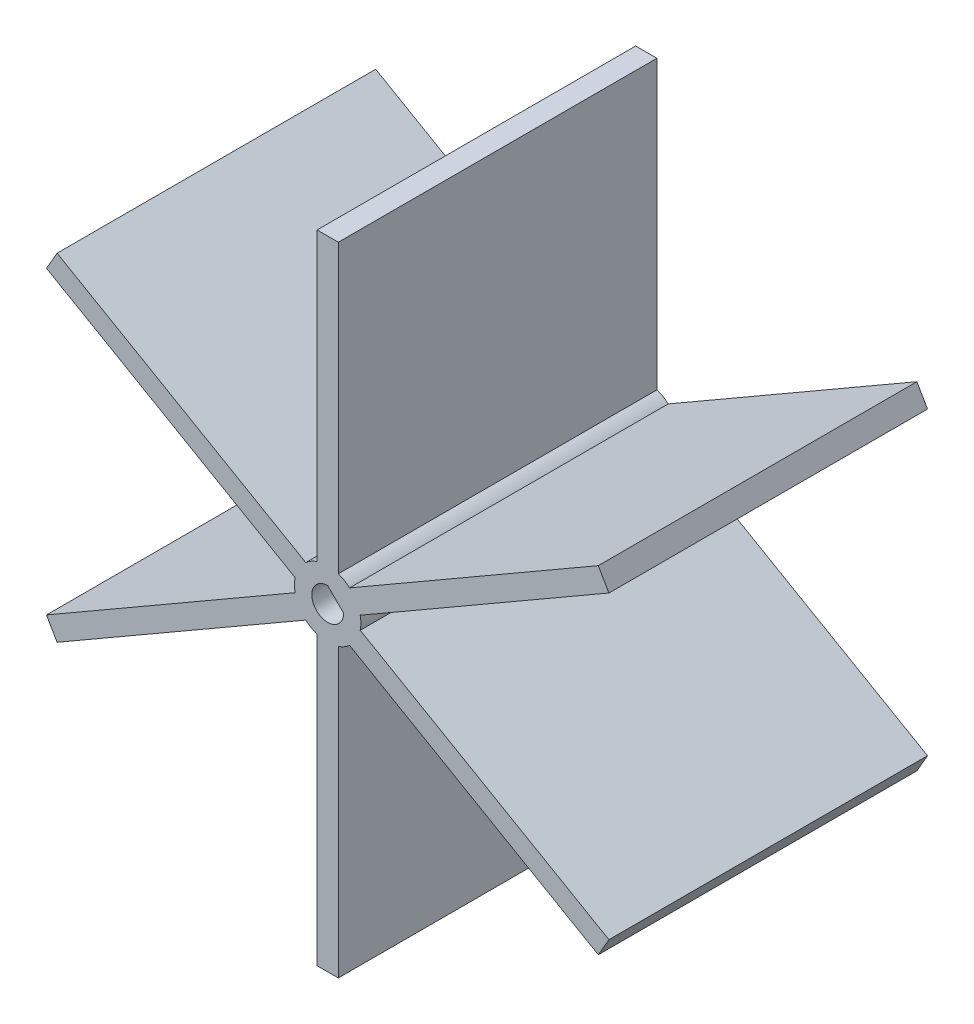
ISO-10303-21;
HEADER;
FILE_DESCRIPTION(('STEP AP214'),'2;1');
FILE_NAME('part.step','',(''),(''),'','','');
FILE_SCHEMA(('AUTOMOTIVE_DESIGN { 1 0 10303 214 1 1 1 1 }'));
ENDSEC;
DATA;
#1=APPLICATION_CONTEXT('core data for automotive mechanical design processes');
#2=APPLICATION_PROTOCOL_DEFINITION('international standard','automotive_design',2000,#1);
#3=PRODUCT_CONTEXT('',#1,'mechanical');
#4=PRODUCT('Part','Part','',(#3));
#5=PRODUCT_RELATED_PRODUCT_CATEGORY('part','',(#4));
#6=PRODUCT_DEFINITION_FORMATION('','',#4);
#7=PRODUCT_DEFINITION_CONTEXT('part definition',#1,'design');
#8=PRODUCT_DEFINITION('design','',#6,#7);
#9=PRODUCT_DEFINITION_SHAPE('','',#8);
#10=(LENGTH_UNIT() NAMED_UNIT(*) SI_UNIT(.MILLI.,.METRE.));
#11=(NAMED_UNIT(*) PLANE_ANGLE_UNIT() SI_UNIT($,.RADIAN.));
#12=(NAMED_UNIT(*) SI_UNIT($,.STERADIAN.) SOLID_ANGLE_UNIT());
#13=UNCERTAINTY_MEASURE_WITH_UNIT(LENGTH_MEASURE(1.E-05),#10,'distance_accuracy_value','');
#14=(GEOMETRIC_REPRESENTATION_CONTEXT(3) GLOBAL_UNCERTAINTY_ASSIGNED_CONTEXT((#13)) GLOBAL_UNIT_ASSIGNED_CONTEXT((#10,
#11,#12)) REPRESENTATION_CONTEXT('',''));
#15=CARTESIAN_POINT('',(0.,0.,0.));
#16=DIRECTION('',(0.,0.,1.));
#17=DIRECTION('',(1.,0.,0.));
#18=AXIS2_PLACEMENT_3D('',#15,#16,#17);
#19=CARTESIAN_POINT('',(0.,0.,0.));
#20=DIRECTION('',(0.,0.,1.));
#21=DIRECTION('',(1.,0.,0.));
#22=AXIS2_PLACEMENT_3D('',#19,#20,#21);
#23=PLANE('',#22);
#24=DIRECTION('',(-0.866025403784439,0.5,0.));
#25=VECTOR('',#24,1.);
#26=CARTESIAN_POINT('',(1.27,2.19970452561247,0.));
#27=LINE('',#26,#25);
#28=CARTESIAN_POINT('',(-5.24262080022321,5.9597678977513,0.));
#29=VERTEX_POINT('',#28);
#30=CARTESIAN_POINT('',(-64.7211357683742,40.2997045256125,0.));
#31=VERTEX_POINT('',#30);
#32=EDGE_CURVE('E607',#29,#31,#27,.T.);
#33=ORIENTED_EDGE('',*,*,#32,.F.);
#34=CARTESIAN_POINT('',(0.,0.,0.));
#35=DIRECTION('',(0.,0.,1.));
#36=DIRECTION('',(1.,0.,0.));
#37=AXIS2_PLACEMENT_3D('',#34,#35,#36);
#38=CIRCLE('',#37,7.9375);
#39=CARTESIAN_POINT('',(-2.54,7.52012674427765,0.));
#40=VERTEX_POINT('',#39);
#41=EDGE_CURVE('E446',#40,#29,#38,.T.);
#42=ORIENTED_EDGE('',*,*,#41,.F.);
#43=DIRECTION('',(0.,1.,0.));
#44=VECTOR('',#43,1.);
#45=CARTESIAN_POINT('',(-2.54,0.,0.));
#46=LINE('',#45,#44);
#47=CARTESIAN_POINT('',(-2.54,76.2,0.));
#48=VERTEX_POINT('',#47);
#49=EDGE_CURVE('E620',#40,#48,#46,.T.);
#50=ORIENTED_EDGE('',*,*,#49,.T.);
#51=DIRECTION('',(1.,0.,0.));
#52=VECTOR('',#51,1.);
#53=CARTESIAN_POINT('',(0.,76.2,0.));
#54=LINE('',#53,#52);
#55=CARTESIAN_POINT('',(2.54,76.2,0.));
#56=VERTEX_POINT('',#55);
#57=EDGE_CURVE('E627',#48,#56,#54,.T.);
#58=ORIENTED_EDGE('',*,*,#57,.T.);
#59=DIRECTION('',(0.,1.,0.));
#60=VECTOR('',#59,1.);
#61=CARTESIAN_POINT('',(2.54,0.,0.));
#62=LINE('',#61,#60);
#63=CARTESIAN_POINT('',(2.54,7.52012674427765,0.));
#64=VERTEX_POINT('',#63);
#65=EDGE_CURVE('E492',#64,#56,#62,.T.);
#66=ORIENTED_EDGE('',*,*,#65,.F.);
#67=CARTESIAN_POINT('',(5.24262080022321,5.9597678977513,0.));
#68=VERTEX_POINT('',#67);
#69=EDGE_CURVE('E449',#68,#64,#38,.T.);
#70=ORIENTED_EDGE('',*,*,#69,.F.);
#71=DIRECTION('',(0.866025403784439,0.5,0.));
#72=VECTOR('',#71,1.);
#73=CARTESIAN_POINT('',(-1.27,2.19970452561247,0.));
#74=LINE('',#73,#72);
#75=CARTESIAN_POINT('',(64.7211357683742,40.2997045256125,0.));
#76=VERTEX_POINT('',#75);
#77=EDGE_CURVE('E475',#68,#76,#74,.T.);
#78=ORIENTED_EDGE('',*,*,#77,.T.);
#79=DIRECTION('',(0.500000000000002,-0.866025403784438,0.));
#80=VECTOR('',#79,1.);
#81=CARTESIAN_POINT('',(65.9911357683741,38.1000000000002,0.));
#82=LINE('',#81,#80);
#83=CARTESIAN_POINT('',(67.2611357683743,35.9002954743875,0.));
#84=VERTEX_POINT('',#83);
#85=EDGE_CURVE('E471',#76,#84,#82,.T.);
#86=ORIENTED_EDGE('',*,*,#85,.T.);
#87=DIRECTION('',(0.866025403784439,0.5,0.));
#88=VECTOR('',#87,1.);
#89=CARTESIAN_POINT('',(1.27,-2.19970452561247,0.));
#90=LINE('',#89,#88);
#91=CARTESIAN_POINT('',(7.78262080022321,1.56035884652635,0.));
#92=VERTEX_POINT('',#91);
#93=EDGE_CURVE('E468',#92,#84,#90,.T.);
#94=ORIENTED_EDGE('',*,*,#93,.F.);
#95=CARTESIAN_POINT('',(7.78262080022321,-1.56035884652635,0.));
#96=VERTEX_POINT('',#95);
#97=EDGE_CURVE('E445',#96,#92,#38,.T.);
#98=ORIENTED_EDGE('',*,*,#97,.F.);
#99=DIRECTION('',(0.866025403784439,-0.5,0.));
#100=VECTOR('',#99,1.);
#101=CARTESIAN_POINT('',(1.27,2.19970452561247,0.));
#102=LINE('',#101,#100);
#103=CARTESIAN_POINT('',(67.2611357683743,-35.9002954743876,0.));
#104=VERTEX_POINT('',#103);
#105=EDGE_CURVE('E496',#96,#104,#102,.T.);
#106=ORIENTED_EDGE('',*,*,#105,.T.);
#107=DIRECTION('',(0.500000000000002,0.866025403784438,0.));
#108=VECTOR('',#107,1.);
#109=CARTESIAN_POINT('',(65.9911357683742,-38.1000000000002,0.));
#110=LINE('',#109,#108);
#111=CARTESIAN_POINT('',(64.7211357683743,-40.2997045256125,0.));
#112=VERTEX_POINT('',#111);
#113=EDGE_CURVE('E503',#112,#104,#110,.T.);
#114=ORIENTED_EDGE('',*,*,#113,.F.);
#115=DIRECTION('',(0.866025403784439,-0.5,0.));
#116=VECTOR('',#115,1.);
#117=CARTESIAN_POINT('',(-1.27,-2.19970452561247,0.));
#118=LINE('',#117,#116);
#119=CARTESIAN_POINT('',(5.24262080022321,-5.9597678977513,0.));
#120=VERTEX_POINT('',#119);
#121=EDGE_CURVE('E501',#120,#112,#118,.T.);
#122=ORIENTED_EDGE('',*,*,#121,.F.);
#123=CARTESIAN_POINT('',(2.54,-7.52012674427765,0.));
#124=VERTEX_POINT('',#123);
#125=EDGE_CURVE('E441',#124,#120,#38,.T.);
#126=ORIENTED_EDGE('',*,*,#125,.F.);
#127=DIRECTION('',(0.,-1.,0.));
#128=VECTOR('',#127,1.);
#129=CARTESIAN_POINT('',(2.54,0.,0.));
#130=LINE('',#129,#128);
#131=CARTESIAN_POINT('',(2.54,-76.2,0.));
#132=VERTEX_POINT('',#131);
#133=EDGE_CURVE('E516',#124,#132,#130,.T.);
#134=ORIENTED_EDGE('',*,*,#133,.T.);
#135=DIRECTION('',(-1.,0.,0.));
#136=VECTOR('',#135,1.);
#137=CARTESIAN_POINT('',(0.,-76.2,0.));
#138=LINE('',#137,#136);
#139=CARTESIAN_POINT('',(-2.54,-76.2,0.));
#140=VERTEX_POINT('',#139);
#141=EDGE_CURVE('E525',#132,#140,#138,.T.);
#142=ORIENTED_EDGE('',*,*,#141,.T.);
#143=DIRECTION('',(0.,-1.,0.));
#144=VECTOR('',#143,1.);
#145=CARTESIAN_POINT('',(-2.54,0.,0.));
#146=LINE('',#145,#144);
#147=CARTESIAN_POINT('',(-2.54,-7.52012674427765,0.));
#148=VERTEX_POINT('',#147);
#149=EDGE_CURVE('E434',#148,#140,#146,.T.);
#150=ORIENTED_EDGE('',*,*,#149,.F.);
#151=CARTESIAN_POINT('',(-5.24262080022321,-5.9597678977513,0.));
#152=VERTEX_POINT('',#151);
#153=EDGE_CURVE('E439',#152,#148,#38,.T.);
#154=ORIENTED_EDGE('',*,*,#153,.F.);
#155=DIRECTION('',(-0.866025403784439,-0.5,0.));
#156=VECTOR('',#155,1.);
#157=CARTESIAN_POINT('',(1.27,-2.19970452561247,0.));
#158=LINE('',#157,#156);
#159=CARTESIAN_POINT('',(-64.7211357683742,-40.2997045256125,0.));
#160=VERTEX_POINT('',#159);
#161=EDGE_CURVE('E421',#152,#160,#158,.T.);
#162=ORIENTED_EDGE('',*,*,#161,.T.);
#163=DIRECTION('',(-0.500000000000002,0.866025403784438,0.));
#164=VECTOR('',#163,1.);
#165=CARTESIAN_POINT('',(-65.9911357683741,-38.1000000000002,0.));
#166=LINE('',#165,#164);
#167=CARTESIAN_POINT('',(-67.2611357683742,-35.9002954743875,0.));
#168=VERTEX_POINT('',#167);
#169=EDGE_CURVE('E412',#160,#168,#166,.T.);
#170=ORIENTED_EDGE('',*,*,#169,.T.);
#171=DIRECTION('',(-0.866025403784439,-0.5,0.));
#172=VECTOR('',#171,1.);
#173=CARTESIAN_POINT('',(-1.27,2.19970452561247,0.));
#174=LINE('',#173,#172);
#175=CARTESIAN_POINT('',(-7.78262080022321,-1.56035884652635,0.));
#176=VERTEX_POINT('',#175);
#177=EDGE_CURVE('E404',#176,#168,#174,.T.);
#178=ORIENTED_EDGE('',*,*,#177,.F.);
#179=CARTESIAN_POINT('',(-7.78262080022321,1.56035884652635,0.));
#180=VERTEX_POINT('',#179);
#181=EDGE_CURVE('E306',#180,#176,#38,.T.);
#182=ORIENTED_EDGE('',*,*,#181,.F.);
#183=DIRECTION('',(-0.866025403784439,0.5,0.));
#184=VECTOR('',#183,1.);
#185=CARTESIAN_POINT('',(-1.27,-2.19970452561247,0.));
#186=LINE('',#185,#184);
#187=CARTESIAN_POINT('',(-67.2611357683743,35.9002954743875,0.));
#188=VERTEX_POINT('',#187);
#189=EDGE_CURVE('E598',#180,#188,#186,.T.);
#190=ORIENTED_EDGE('',*,*,#189,.T.);
#191=DIRECTION('',(0.500000000000002,0.866025403784438,0.));
#192=VECTOR('',#191,1.);
#193=CARTESIAN_POINT('',(-65.9911357683741,38.1000000000002,0.));
#194=LINE('',#193,#192);
#195=EDGE_CURVE('E602',#188,#31,#194,.T.);
#196=ORIENTED_EDGE('',*,*,#195,.T.);
#197=EDGE_LOOP('',(#33,#42,#50,#58,#66,#70,#78,#86,#94,#98,#106,#114,#122,#126,#134,#142,#150,
#154,#162,#170,#178,#182,#190,#196));
#198=FACE_BOUND('',#197,.T.);
#199=DIRECTION('',(0.707106781186548,-0.707106781186548,0.));
#200=VECTOR('',#199,1.);
#201=CARTESIAN_POINT('',(1.905,1.905,0.));
#202=LINE('',#201,#200);
#203=CARTESIAN_POINT('',(0.,3.81,0.));
#204=VERTEX_POINT('',#203);
#205=CARTESIAN_POINT('',(3.81,0.,0.));
#206=VERTEX_POINT('',#205);
#207=EDGE_CURVE('E304',#204,#206,#202,.T.);
#208=ORIENTED_EDGE('',*,*,#207,.F.);
#209=CARTESIAN_POINT('',(0.,0.,0.));
#210=DIRECTION('',(0.,0.,1.));
#211=DIRECTION('',(1.,0.,0.));
#212=AXIS2_PLACEMENT_3D('',#209,#210,#211);
#213=CIRCLE('',#212,3.81);
#214=EDGE_CURVE('E649',#204,#206,#213,.T.);
#215=ORIENTED_EDGE('',*,*,#214,.T.);
#216=EDGE_LOOP('',(#208,#215));
#217=FACE_BOUND('',#216,.T.);
#218=ADVANCED_FACE('F128',(#198,#217),#23,.F.);
#219=CARTESIAN_POINT('',(0.,0.,76.2));
#220=DIRECTION('',(0.,0.,1.));
#221=DIRECTION('',(1.,0.,0.));
#222=AXIS2_PLACEMENT_3D('',#219,#220,#221);
#223=PLANE('',#222);
#224=DIRECTION('',(-0.866025403784439,0.5,0.));
#225=VECTOR('',#224,1.);
#226=CARTESIAN_POINT('',(-1.27,-2.19970452561247,76.2));
#227=LINE('',#226,#225);
#228=CARTESIAN_POINT('',(-7.78262080022321,1.56035884652635,76.2));
#229=VERTEX_POINT('',#228);
#230=CARTESIAN_POINT('',(-67.2611357683743,35.9002954743875,76.2));
#231=VERTEX_POINT('',#230);
#232=EDGE_CURVE('E546',#229,#231,#227,.T.);
#233=ORIENTED_EDGE('',*,*,#232,.F.);
#234=CARTESIAN_POINT('',(0.,0.,76.2));
#235=DIRECTION('',(0.,0.,1.));
#236=DIRECTION('',(1.,0.,0.));
#237=AXIS2_PLACEMENT_3D('',#234,#235,#236);
#238=CIRCLE('',#237,7.9375);
#239=CARTESIAN_POINT('',(-7.78262080022321,-1.56035884652635,76.2));
#240=VERTEX_POINT('',#239);
#241=EDGE_CURVE('E438',#229,#240,#238,.T.);
#242=ORIENTED_EDGE('',*,*,#241,.T.);
#243=DIRECTION('',(-0.866025403784439,-0.5,0.));
#244=VECTOR('',#243,1.);
#245=CARTESIAN_POINT('',(-1.27,2.19970452561247,76.2));
#246=LINE('',#245,#244);
#247=CARTESIAN_POINT('',(-67.2611357683742,-35.9002954743875,76.2));
#248=VERTEX_POINT('',#247);
#249=EDGE_CURVE('E423',#240,#248,#246,.T.);
#250=ORIENTED_EDGE('',*,*,#249,.T.);
#251=DIRECTION('',(-0.500000000000002,0.866025403784438,0.));
#252=VECTOR('',#251,1.);
#253=CARTESIAN_POINT('',(-65.9911357683741,-38.1000000000002,76.2));
#254=LINE('',#253,#252);
#255=CARTESIAN_POINT('',(-64.7211357683742,-40.2997045256125,76.2));
#256=VERTEX_POINT('',#255);
#257=EDGE_CURVE('E537',#256,#248,#254,.T.);
#258=ORIENTED_EDGE('',*,*,#257,.F.);
#259=DIRECTION('',(-0.866025403784439,-0.5,0.));
#260=VECTOR('',#259,1.);
#261=CARTESIAN_POINT('',(1.27,-2.19970452561247,76.2));
#262=LINE('',#261,#260);
#263=CARTESIAN_POINT('',(-5.24262080022321,-5.9597678977513,76.2));
#264=VERTEX_POINT('',#263);
#265=EDGE_CURVE('E430',#264,#256,#262,.T.);
#266=ORIENTED_EDGE('',*,*,#265,.F.);
#267=CARTESIAN_POINT('',(-2.54,-7.52012674427765,76.2));
#268=VERTEX_POINT('',#267);
#269=EDGE_CURVE('E413',#264,#268,#238,.T.);
#270=ORIENTED_EDGE('',*,*,#269,.T.);
#271=DIRECTION('',(0.,-1.,0.));
#272=VECTOR('',#271,1.);
#273=CARTESIAN_POINT('',(-2.54,0.,76.2));
#274=LINE('',#273,#272);
#275=CARTESIAN_POINT('',(-2.54,-76.2,76.2));
#276=VERTEX_POINT('',#275);
#277=EDGE_CURVE('E513',#268,#276,#274,.T.);
#278=ORIENTED_EDGE('',*,*,#277,.T.);
#279=DIRECTION('',(-1.,0.,0.));
#280=VECTOR('',#279,1.);
#281=CARTESIAN_POINT('',(0.,-76.2,76.2));
#282=LINE('',#281,#280);
#283=CARTESIAN_POINT('',(2.54,-76.2,76.2));
#284=VERTEX_POINT('',#283);
#285=EDGE_CURVE('E515',#284,#276,#282,.T.);
#286=ORIENTED_EDGE('',*,*,#285,.F.);
#287=DIRECTION('',(0.,-1.,0.));
#288=VECTOR('',#287,1.);
#289=CARTESIAN_POINT('',(2.54,0.,76.2));
#290=LINE('',#289,#288);
#291=CARTESIAN_POINT('',(2.54,-7.52012674427765,76.2));
#292=VERTEX_POINT('',#291);
#293=EDGE_CURVE('E519',#292,#284,#290,.T.);
#294=ORIENTED_EDGE('',*,*,#293,.F.);
#295=CARTESIAN_POINT('',(5.24262080022321,-5.9597678977513,76.2));
#296=VERTEX_POINT('',#295);
#297=EDGE_CURVE('E437',#292,#296,#238,.T.);
#298=ORIENTED_EDGE('',*,*,#297,.T.);
#299=DIRECTION('',(0.866025403784439,-0.5,0.));
#300=VECTOR('',#299,1.);
#301=CARTESIAN_POINT('',(-1.27,-2.19970452561247,76.2));
#302=LINE('',#301,#300);
#303=CARTESIAN_POINT('',(64.7211357683743,-40.2997045256125,76.2));
#304=VERTEX_POINT('',#303);
#305=EDGE_CURVE('E493',#296,#304,#302,.T.);
#306=ORIENTED_EDGE('',*,*,#305,.T.);
#307=DIRECTION('',(0.500000000000002,0.866025403784438,0.));
#308=VECTOR('',#307,1.);
#309=CARTESIAN_POINT('',(65.9911357683742,-38.1000000000002,76.2));
#310=LINE('',#309,#308);
#311=CARTESIAN_POINT('',(67.2611357683743,-35.9002954743876,76.2));
#312=VERTEX_POINT('',#311);
#313=EDGE_CURVE('E495',#304,#312,#310,.T.);
#314=ORIENTED_EDGE('',*,*,#313,.T.);
#315=DIRECTION('',(0.866025403784439,-0.5,0.));
#316=VECTOR('',#315,1.);
#317=CARTESIAN_POINT('',(1.27,2.19970452561247,76.2));
#318=LINE('',#317,#316);
#319=CARTESIAN_POINT('',(7.78262080022321,-1.56035884652635,76.2));
#320=VERTEX_POINT('',#319);
#321=EDGE_CURVE('E498',#320,#312,#318,.T.);
#322=ORIENTED_EDGE('',*,*,#321,.F.);
#323=CARTESIAN_POINT('',(7.78262080022321,1.56035884652635,76.2));
#324=VERTEX_POINT('',#323);
#325=EDGE_CURVE('E578',#320,#324,#238,.T.);
#326=ORIENTED_EDGE('',*,*,#325,.T.);
#327=DIRECTION('',(0.866025403784439,0.5,0.));
#328=VECTOR('',#327,1.);
#329=CARTESIAN_POINT('',(1.27,-2.19970452561247,76.2));
#330=LINE('',#329,#328);
#331=CARTESIAN_POINT('',(67.2611357683743,35.9002954743875,76.2));
#332=VERTEX_POINT('',#331);
#333=EDGE_CURVE('E484',#324,#332,#330,.T.);
#334=ORIENTED_EDGE('',*,*,#333,.T.);
#335=DIRECTION('',(0.500000000000002,-0.866025403784438,0.));
#336=VECTOR('',#335,1.);
#337=CARTESIAN_POINT('',(65.9911357683741,38.1000000000002,76.2));
#338=LINE('',#337,#336);
#339=CARTESIAN_POINT('',(64.7211357683742,40.2997045256125,76.2));
#340=VERTEX_POINT('',#339);
#341=EDGE_CURVE('E638',#340,#332,#338,.T.);
#342=ORIENTED_EDGE('',*,*,#341,.F.);
#343=DIRECTION('',(0.866025403784439,0.5,0.));
#344=VECTOR('',#343,1.);
#345=CARTESIAN_POINT('',(-1.27,2.19970452561247,76.2));
#346=LINE('',#345,#344);
#347=CARTESIAN_POINT('',(5.24262080022321,5.9597678977513,76.2));
#348=VERTEX_POINT('',#347);
#349=EDGE_CURVE('E480',#348,#340,#346,.T.);
#350=ORIENTED_EDGE('',*,*,#349,.F.);
#351=CARTESIAN_POINT('',(2.54,7.52012674427765,76.2));
#352=VERTEX_POINT('',#351);
#353=EDGE_CURVE('E579',#348,#352,#238,.T.);
#354=ORIENTED_EDGE('',*,*,#353,.T.);
#355=DIRECTION('',(0.,1.,0.));
#356=VECTOR('',#355,1.);
#357=CARTESIAN_POINT('',(2.54,0.,76.2));
#358=LINE('',#357,#356);
#359=CARTESIAN_POINT('',(2.54,76.2,76.2));
#360=VERTEX_POINT('',#359);
#361=EDGE_CURVE('E617',#352,#360,#358,.T.);
#362=ORIENTED_EDGE('',*,*,#361,.T.);
#363=DIRECTION('',(1.,0.,0.));
#364=VECTOR('',#363,1.);
#365=CARTESIAN_POINT('',(0.,76.2,76.2));
#366=LINE('',#365,#364);
#367=CARTESIAN_POINT('',(-2.54,76.2,76.2));
#368=VERTEX_POINT('',#367);
#369=EDGE_CURVE('E619',#368,#360,#366,.T.);
#370=ORIENTED_EDGE('',*,*,#369,.F.);
#371=DIRECTION('',(0.,1.,0.));
#372=VECTOR('',#371,1.);
#373=CARTESIAN_POINT('',(-2.54,0.,76.2));
#374=LINE('',#373,#372);
#375=CARTESIAN_POINT('',(-2.54,7.52012674427765,76.2));
#376=VERTEX_POINT('',#375);
#377=EDGE_CURVE('E593',#376,#368,#374,.T.);
#378=ORIENTED_EDGE('',*,*,#377,.F.);
#379=CARTESIAN_POINT('',(-5.24262080022321,5.9597678977513,76.2));
#380=VERTEX_POINT('',#379);
#381=EDGE_CURVE('E443',#376,#380,#238,.T.);
#382=ORIENTED_EDGE('',*,*,#381,.T.);
#383=DIRECTION('',(-0.866025403784439,0.5,0.));
#384=VECTOR('',#383,1.);
#385=CARTESIAN_POINT('',(1.27,2.19970452561247,76.2));
#386=LINE('',#385,#384);
#387=CARTESIAN_POINT('',(-64.7211357683742,40.2997045256125,76.2));
#388=VERTEX_POINT('',#387);
#389=EDGE_CURVE('E589',#380,#388,#386,.T.);
#390=ORIENTED_EDGE('',*,*,#389,.T.);
#391=DIRECTION('',(0.500000000000002,0.866025403784438,0.));
#392=VECTOR('',#391,1.);
#393=CARTESIAN_POINT('',(-65.9911357683741,38.1000000000002,76.2));
#394=LINE('',#393,#392);
#395=EDGE_CURVE('E597',#231,#388,#394,.T.);
#396=ORIENTED_EDGE('',*,*,#395,.F.);
#397=EDGE_LOOP('',(#233,#242,#250,#258,#266,#270,#278,#286,#294,#298,#306,#314,#322,#326,#334,
#342,#350,#354,#362,#370,#378,#382,#390,#396));
#398=FACE_BOUND('',#397,.T.);
#399=CARTESIAN_POINT('',(0.,0.,76.2));
#400=DIRECTION('',(0.,0.,1.));
#401=DIRECTION('',(1.,0.,0.));
#402=AXIS2_PLACEMENT_3D('',#399,#400,#401);
#403=CIRCLE('',#402,3.81);
#404=CARTESIAN_POINT('',(0.,3.81,76.2));
#405=VERTEX_POINT('',#404);
#406=CARTESIAN_POINT('',(3.81,0.,76.2));
#407=VERTEX_POINT('',#406);
#408=EDGE_CURVE('E137',#405,#407,#403,.T.);
#409=ORIENTED_EDGE('',*,*,#408,.F.);
#410=DIRECTION('',(0.707106781186547,-0.707106781186547,0.));
#411=VECTOR('',#410,1.);
#412=CARTESIAN_POINT('',(0.,3.81,76.2));
#413=LINE('',#412,#411);
#414=EDGE_CURVE('E12',#405,#407,#413,.T.);
#415=ORIENTED_EDGE('',*,*,#414,.T.);
#416=EDGE_LOOP('',(#409,#415));
#417=FACE_BOUND('',#416,.T.);
#418=ADVANCED_FACE('F308',(#398,#417),#223,.T.);
#419=CARTESIAN_POINT('',(1.27,2.19970452561247,76.2));
#420=DIRECTION('',(-0.5,-0.866025403784439,0.));
#421=DIRECTION('',(0.866025403784438,-0.5,0.));
#422=AXIS2_PLACEMENT_3D('',#419,#420,#421);
#423=PLANE('',#422);
#424=ORIENTED_EDGE('',*,*,#32,.T.);
#425=DIRECTION('',(0.,0.,-1.));
#426=VECTOR('',#425,1.);
#427=CARTESIAN_POINT('',(-64.7211357683742,40.2997045256125,76.2));
#428=LINE('',#427,#426);
#429=EDGE_CURVE('E595',#388,#31,#428,.T.);
#430=ORIENTED_EDGE('',*,*,#429,.F.);
#431=ORIENTED_EDGE('',*,*,#389,.F.);
#432=DIRECTION('',(0.,0.,-1.));
#433=VECTOR('',#432,1.);
#434=CARTESIAN_POINT('',(-5.24262080022321,5.9597678977513,76.2));
#435=LINE('',#434,#433);
#436=EDGE_CURVE('E301',#380,#29,#435,.T.);
#437=ORIENTED_EDGE('',*,*,#436,.T.);
#438=EDGE_LOOP('',(#424,#430,#431,#437));
#439=FACE_BOUND('',#438,.T.);
#440=ADVANCED_FACE('F310',(#439),#423,.F.);
#441=CARTESIAN_POINT('',(-65.9911357683741,38.1000000000002,76.2));
#442=DIRECTION('',(-0.866025403784437,0.500000000000002,0.));
#443=DIRECTION('',(-0.500000000000002,-0.866025403784437,0.));
#444=AXIS2_PLACEMENT_3D('',#441,#442,#443);
#445=PLANE('',#444);
#446=ORIENTED_EDGE('',*,*,#195,.F.);
#447=DIRECTION('',(0.,0.,-1.));
#448=VECTOR('',#447,1.);
#449=CARTESIAN_POINT('',(-67.2611357683743,35.9002954743875,76.2));
#450=LINE('',#449,#448);
#451=EDGE_CURVE('E613',#231,#188,#450,.T.);
#452=ORIENTED_EDGE('',*,*,#451,.F.);
#453=ORIENTED_EDGE('',*,*,#395,.T.);
#454=ORIENTED_EDGE('',*,*,#429,.T.);
#455=EDGE_LOOP('',(#446,#452,#453,#454));
#456=FACE_BOUND('',#455,.T.);
#457=ADVANCED_FACE('F317',(#456),#445,.T.);
#458=CARTESIAN_POINT('',(-1.27,-2.19970452561247,76.2));
#459=DIRECTION('',(-0.5,-0.866025403784439,0.));
#460=DIRECTION('',(0.866025403784439,-0.5,0.));
#461=AXIS2_PLACEMENT_3D('',#458,#459,#460);
#462=PLANE('',#461);
#463=ORIENTED_EDGE('',*,*,#189,.F.);
#464=DIRECTION('',(0.,0.,-1.));
#465=VECTOR('',#464,1.);
#466=CARTESIAN_POINT('',(-7.78262080022321,1.56035884652635,76.2));
#467=LINE('',#466,#465);
#468=EDGE_CURVE('E547',#229,#180,#467,.T.);
#469=ORIENTED_EDGE('',*,*,#468,.F.);
#470=ORIENTED_EDGE('',*,*,#232,.T.);
#471=ORIENTED_EDGE('',*,*,#451,.T.);
#472=EDGE_LOOP('',(#463,#469,#470,#471));
#473=FACE_BOUND('',#472,.T.);
#474=ADVANCED_FACE('F326',(#473),#462,.T.);
#475=CARTESIAN_POINT('',(-2.54,0.,76.2));
#476=DIRECTION('',(1.,0.,0.));
#477=DIRECTION('',(0.,0.,-1.));
#478=AXIS2_PLACEMENT_3D('',#475,#476,#477);
#479=PLANE('',#478);
#480=ORIENTED_EDGE('',*,*,#149,.T.);
#481=DIRECTION('',(0.,0.,-1.));
#482=VECTOR('',#481,1.);
#483=CARTESIAN_POINT('',(-2.54,-76.2,76.2));
#484=LINE('',#483,#482);
#485=EDGE_CURVE('E533',#276,#140,#484,.T.);
#486=ORIENTED_EDGE('',*,*,#485,.F.);
#487=ORIENTED_EDGE('',*,*,#277,.F.);
#488=DIRECTION('',(0.,0.,-1.));
#489=VECTOR('',#488,1.);
#490=CARTESIAN_POINT('',(-2.54,-7.52012674427765,76.2));
#491=LINE('',#490,#489);
#492=EDGE_CURVE('E504',#268,#148,#491,.T.);
#493=ORIENTED_EDGE('',*,*,#492,.T.);
#494=EDGE_LOOP('',(#480,#486,#487,#493));
#495=FACE_BOUND('',#494,.T.);
#496=ADVANCED_FACE('F329',(#495),#479,.F.);
#497=CARTESIAN_POINT('',(0.,-76.2,76.2));
#498=DIRECTION('',(0.,-1.,0.));
#499=DIRECTION('',(0.,0.,-1.));
#500=AXIS2_PLACEMENT_3D('',#497,#498,#499);
#501=PLANE('',#500);
#502=ORIENTED_EDGE('',*,*,#141,.F.);
#503=DIRECTION('',(0.,0.,-1.));
#504=VECTOR('',#503,1.);
#505=CARTESIAN_POINT('',(2.54,-76.2,76.2));
#506=LINE('',#505,#504);
#507=EDGE_CURVE('E531',#284,#132,#506,.T.);
#508=ORIENTED_EDGE('',*,*,#507,.F.);
#509=ORIENTED_EDGE('',*,*,#285,.T.);
#510=ORIENTED_EDGE('',*,*,#485,.T.);
#511=EDGE_LOOP('',(#502,#508,#509,#510));
#512=FACE_BOUND('',#511,.T.);
#513=ADVANCED_FACE('F380',(#512),#501,.T.);
#514=CARTESIAN_POINT('',(2.54,0.,76.2));
#515=DIRECTION('',(1.,0.,0.));
#516=DIRECTION('',(0.,0.,-1.));
#517=AXIS2_PLACEMENT_3D('',#514,#515,#516);
#518=PLANE('',#517);
#519=ORIENTED_EDGE('',*,*,#133,.F.);
#520=DIRECTION('',(0.,0.,-1.));
#521=VECTOR('',#520,1.);
#522=CARTESIAN_POINT('',(2.54,-7.52012674427765,76.2));
#523=LINE('',#522,#521);
#524=EDGE_CURVE('E522',#292,#124,#523,.T.);
#525=ORIENTED_EDGE('',*,*,#524,.F.);
#526=ORIENTED_EDGE('',*,*,#293,.T.);
#527=ORIENTED_EDGE('',*,*,#507,.T.);
#528=EDGE_LOOP('',(#519,#525,#526,#527));
#529=FACE_BOUND('',#528,.T.);
#530=ADVANCED_FACE('F376',(#529),#518,.T.);
#531=CARTESIAN_POINT('',(-1.27,-2.19970452561247,76.2));
#532=DIRECTION('',(0.5,0.866025403784439,0.));
#533=DIRECTION('',(-0.866025403784438,0.5,0.));
#534=AXIS2_PLACEMENT_3D('',#531,#532,#533);
#535=PLANE('',#534);
#536=ORIENTED_EDGE('',*,*,#121,.T.);
#537=DIRECTION('',(0.,0.,-1.));
#538=VECTOR('',#537,1.);
#539=CARTESIAN_POINT('',(64.7211357683743,-40.2997045256125,76.2));
#540=LINE('',#539,#538);
#541=EDGE_CURVE('E477',#304,#112,#540,.T.);
#542=ORIENTED_EDGE('',*,*,#541,.F.);
#543=ORIENTED_EDGE('',*,*,#305,.F.);
#544=DIRECTION('',(0.,0.,-1.));
#545=VECTOR('',#544,1.);
#546=CARTESIAN_POINT('',(5.24262080022321,-5.9597678977513,76.2));
#547=LINE('',#546,#545);
#548=EDGE_CURVE('E473',#296,#120,#547,.T.);
#549=ORIENTED_EDGE('',*,*,#548,.T.);
#550=EDGE_LOOP('',(#536,#542,#543,#549));
#551=FACE_BOUND('',#550,.T.);
#552=ADVANCED_FACE('F372',(#551),#535,.F.);
#553=CARTESIAN_POINT('',(65.9911357683742,-38.1000000000002,76.2));
#554=DIRECTION('',(-0.866025403784437,0.500000000000002,0.));
#555=DIRECTION('',(-0.500000000000002,-0.866025403784437,0.));
#556=AXIS2_PLACEMENT_3D('',#553,#554,#555);
#557=PLANE('',#556);
#558=ORIENTED_EDGE('',*,*,#113,.T.);
#559=DIRECTION('',(0.,0.,-1.));
#560=VECTOR('',#559,1.);
#561=CARTESIAN_POINT('',(67.2611357683743,-35.9002954743876,76.2));
#562=LINE('',#561,#560);
#563=EDGE_CURVE('E509',#312,#104,#562,.T.);
#564=ORIENTED_EDGE('',*,*,#563,.F.);
#565=ORIENTED_EDGE('',*,*,#313,.F.);
#566=ORIENTED_EDGE('',*,*,#541,.T.);
#567=EDGE_LOOP('',(#558,#564,#565,#566));
#568=FACE_BOUND('',#567,.T.);
#569=ADVANCED_FACE('F367',(#568),#557,.F.);
#570=CARTESIAN_POINT('',(1.27,2.19970452561247,76.2));
#571=DIRECTION('',(0.5,0.866025403784439,0.));
#572=DIRECTION('',(-0.866025403784439,0.5,0.));
#573=AXIS2_PLACEMENT_3D('',#570,#571,#572);
#574=PLANE('',#573);
#575=ORIENTED_EDGE('',*,*,#105,.F.);
#576=DIRECTION('',(0.,0.,-1.));
#577=VECTOR('',#576,1.);
#578=CARTESIAN_POINT('',(7.78262080022321,-1.56035884652635,76.2));
#579=LINE('',#578,#577);
#580=EDGE_CURVE('E463',#320,#96,#579,.T.);
#581=ORIENTED_EDGE('',*,*,#580,.F.);
#582=ORIENTED_EDGE('',*,*,#321,.T.);
#583=ORIENTED_EDGE('',*,*,#563,.T.);
#584=EDGE_LOOP('',(#575,#581,#582,#583));
#585=FACE_BOUND('',#584,.T.);
#586=ADVANCED_FACE('F363',(#585),#574,.T.);
#587=CARTESIAN_POINT('',(1.27,-2.19970452561247,76.2));
#588=DIRECTION('',(-0.5,0.866025403784439,0.));
#589=DIRECTION('',(-0.866025403784439,-0.5,0.));
#590=AXIS2_PLACEMENT_3D('',#587,#588,#589);
#591=PLANE('',#590);
#592=ORIENTED_EDGE('',*,*,#93,.T.);
#593=DIRECTION('',(0.,0.,-1.));
#594=VECTOR('',#593,1.);
#595=CARTESIAN_POINT('',(67.2611357683743,35.9002954743875,76.2));
#596=LINE('',#595,#594);
#597=EDGE_CURVE('E489',#332,#84,#596,.T.);
#598=ORIENTED_EDGE('',*,*,#597,.F.);
#599=ORIENTED_EDGE('',*,*,#333,.F.);
#600=DIRECTION('',(0.,0.,-1.));
#601=VECTOR('',#600,1.);
#602=CARTESIAN_POINT('',(7.78262080022321,1.56035884652635,76.2));
#603=LINE('',#602,#601);
#604=EDGE_CURVE('E461',#324,#92,#603,.T.);
#605=ORIENTED_EDGE('',*,*,#604,.T.);
#606=EDGE_LOOP('',(#592,#598,#599,#605));
#607=FACE_BOUND('',#606,.T.);
#608=ADVANCED_FACE('F359',(#607),#591,.F.);
#609=CARTESIAN_POINT('',(65.9911357683741,38.1000000000002,76.2));
#610=DIRECTION('',(0.866025403784437,0.500000000000002,0.));
#611=DIRECTION('',(-0.500000000000002,0.866025403784437,0.));
#612=AXIS2_PLACEMENT_3D('',#609,#610,#611);
#613=PLANE('',#612);
#614=ORIENTED_EDGE('',*,*,#85,.F.);
#615=DIRECTION('',(0.,0.,-1.));
#616=VECTOR('',#615,1.);
#617=CARTESIAN_POINT('',(64.7211357683742,40.2997045256125,76.2));
#618=LINE('',#617,#616);
#619=EDGE_CURVE('E487',#340,#76,#618,.T.);
#620=ORIENTED_EDGE('',*,*,#619,.F.);
#621=ORIENTED_EDGE('',*,*,#341,.T.);
#622=ORIENTED_EDGE('',*,*,#597,.T.);
#623=EDGE_LOOP('',(#614,#620,#621,#622));
#624=FACE_BOUND('',#623,.T.);
#625=ADVANCED_FACE('F354',(#624),#613,.T.);
#626=CARTESIAN_POINT('',(-1.27,2.19970452561247,76.2));
#627=DIRECTION('',(-0.5,0.866025403784439,0.));
#628=DIRECTION('',(-0.866025403784438,-0.5,0.));
#629=AXIS2_PLACEMENT_3D('',#626,#627,#628);
#630=PLANE('',#629);
#631=ORIENTED_EDGE('',*,*,#77,.F.);
#632=DIRECTION('',(0.,0.,-1.));
#633=VECTOR('',#632,1.);
#634=CARTESIAN_POINT('',(5.24262080022321,5.9597678977513,76.2));
#635=LINE('',#634,#633);
#636=EDGE_CURVE('E485',#348,#68,#635,.T.);
#637=ORIENTED_EDGE('',*,*,#636,.F.);
#638=ORIENTED_EDGE('',*,*,#349,.T.);
#639=ORIENTED_EDGE('',*,*,#619,.T.);
#640=EDGE_LOOP('',(#631,#637,#638,#639));
#641=FACE_BOUND('',#640,.T.);
#642=ADVANCED_FACE('F350',(#641),#630,.T.);
#643=CARTESIAN_POINT('',(2.54,0.,76.2));
#644=DIRECTION('',(-1.,0.,0.));
#645=DIRECTION('',(0.,0.,1.));
#646=AXIS2_PLACEMENT_3D('',#643,#644,#645);
#647=PLANE('',#646);
#648=ORIENTED_EDGE('',*,*,#65,.T.);
#649=DIRECTION('',(0.,0.,-1.));
#650=VECTOR('',#649,1.);
#651=CARTESIAN_POINT('',(2.54,76.2,76.2));
#652=LINE('',#651,#650);
#653=EDGE_CURVE('E635',#360,#56,#652,.T.);
#654=ORIENTED_EDGE('',*,*,#653,.F.);
#655=ORIENTED_EDGE('',*,*,#361,.F.);
#656=DIRECTION('',(0.,0.,-1.));
#657=VECTOR('',#656,1.);
#658=CARTESIAN_POINT('',(2.54,7.52012674427765,76.2));
#659=LINE('',#658,#657);
#660=EDGE_CURVE('E609',#352,#64,#659,.T.);
#661=ORIENTED_EDGE('',*,*,#660,.T.);
#662=EDGE_LOOP('',(#648,#654,#655,#661));
#663=FACE_BOUND('',#662,.T.);
#664=ADVANCED_FACE('F346',(#663),#647,.F.);
#665=CARTESIAN_POINT('',(0.,76.2,76.2));
#666=DIRECTION('',(0.,1.,0.));
#667=DIRECTION('',(0.,0.,1.));
#668=AXIS2_PLACEMENT_3D('',#665,#666,#667);
#669=PLANE('',#668);
#670=ORIENTED_EDGE('',*,*,#57,.F.);
#671=DIRECTION('',(0.,0.,-1.));
#672=VECTOR('',#671,1.);
#673=CARTESIAN_POINT('',(-2.54,76.2,76.2));
#674=LINE('',#673,#672);
#675=EDGE_CURVE('E633',#368,#48,#674,.T.);
#676=ORIENTED_EDGE('',*,*,#675,.F.);
#677=ORIENTED_EDGE('',*,*,#369,.T.);
#678=ORIENTED_EDGE('',*,*,#653,.T.);
#679=EDGE_LOOP('',(#670,#676,#677,#678));
#680=FACE_BOUND('',#679,.T.);
#681=ADVANCED_FACE('F342',(#680),#669,.T.);
#682=CARTESIAN_POINT('',(-65.9911357683741,-38.1000000000002,76.2));
#683=DIRECTION('',(-0.866025403784437,-0.500000000000002,0.));
#684=DIRECTION('',(0.500000000000002,-0.866025403784437,0.));
#685=AXIS2_PLACEMENT_3D('',#682,#683,#684);
#686=PLANE('',#685);
#687=ORIENTED_EDGE('',*,*,#169,.F.);
#688=DIRECTION('',(0.,0.,-1.));
#689=VECTOR('',#688,1.);
#690=CARTESIAN_POINT('',(-64.7211357683742,-40.2997045256125,76.2));
#691=LINE('',#690,#689);
#692=EDGE_CURVE('E429',#256,#160,#691,.T.);
#693=ORIENTED_EDGE('',*,*,#692,.F.);
#694=ORIENTED_EDGE('',*,*,#257,.T.);
#695=DIRECTION('',(0.,0.,-1.));
#696=VECTOR('',#695,1.);
#697=CARTESIAN_POINT('',(-67.2611357683742,-35.9002954743875,76.2));
#698=LINE('',#697,#696);
#699=EDGE_CURVE('E407',#248,#168,#698,.T.);
#700=ORIENTED_EDGE('',*,*,#699,.T.);
#701=EDGE_LOOP('',(#687,#693,#694,#700));
#702=FACE_BOUND('',#701,.T.);
#703=ADVANCED_FACE('F345',(#702),#686,.T.);
#704=CARTESIAN_POINT('',(1.27,-2.19970452561247,76.2));
#705=DIRECTION('',(0.5,-0.866025403784439,0.));
#706=DIRECTION('',(0.866025403784438,0.5,0.));
#707=AXIS2_PLACEMENT_3D('',#704,#705,#706);
#708=PLANE('',#707);
#709=ORIENTED_EDGE('',*,*,#161,.F.);
#710=DIRECTION('',(0.,0.,-1.));
#711=VECTOR('',#710,1.);
#712=CARTESIAN_POINT('',(-5.24262080022321,-5.9597678977513,76.2));
#713=LINE('',#712,#711);
#714=EDGE_CURVE('E427',#264,#152,#713,.T.);
#715=ORIENTED_EDGE('',*,*,#714,.F.);
#716=ORIENTED_EDGE('',*,*,#265,.T.);
#717=ORIENTED_EDGE('',*,*,#692,.T.);
#718=EDGE_LOOP('',(#709,#715,#716,#717));
#719=FACE_BOUND('',#718,.T.);
#720=ADVANCED_FACE('F339',(#719),#708,.T.);
#721=CARTESIAN_POINT('',(-2.54,0.,76.2));
#722=DIRECTION('',(-1.,0.,0.));
#723=DIRECTION('',(0.,0.,1.));
#724=AXIS2_PLACEMENT_3D('',#721,#722,#723);
#725=PLANE('',#724);
#726=ORIENTED_EDGE('',*,*,#49,.F.);
#727=DIRECTION('',(0.,0.,-1.));
#728=VECTOR('',#727,1.);
#729=CARTESIAN_POINT('',(-2.54,7.52012674427765,76.2));
#730=LINE('',#729,#728);
#731=EDGE_CURVE('E624',#376,#40,#730,.T.);
#732=ORIENTED_EDGE('',*,*,#731,.F.);
#733=ORIENTED_EDGE('',*,*,#377,.T.);
#734=ORIENTED_EDGE('',*,*,#675,.T.);
#735=EDGE_LOOP('',(#726,#732,#733,#734));
#736=FACE_BOUND('',#735,.T.);
#737=ADVANCED_FACE('F335',(#736),#725,.T.);
#738=CARTESIAN_POINT('',(-1.27,2.19970452561247,76.2));
#739=DIRECTION('',(0.5,-0.866025403784439,0.));
#740=DIRECTION('',(0.866025403784439,0.5,0.));
#741=AXIS2_PLACEMENT_3D('',#738,#739,#740);
#742=PLANE('',#741);
#743=ORIENTED_EDGE('',*,*,#177,.T.);
#744=ORIENTED_EDGE('',*,*,#699,.F.);
#745=ORIENTED_EDGE('',*,*,#249,.F.);
#746=DIRECTION('',(0.,0.,-1.));
#747=VECTOR('',#746,1.);
#748=CARTESIAN_POINT('',(-7.78262080022321,-1.56035884652635,76.2));
#749=LINE('',#748,#747);
#750=EDGE_CURVE('E410',#240,#176,#749,.T.);
#751=ORIENTED_EDGE('',*,*,#750,.T.);
#752=EDGE_LOOP('',(#743,#744,#745,#751));
#753=FACE_BOUND('',#752,.T.);
#754=ADVANCED_FACE('F338',(#753),#742,.F.);
#755=CARTESIAN_POINT('',(0.,0.,76.2));
#756=DIRECTION('',(0.,0.,-1.));
#757=DIRECTION('',(-1.,0.,0.));
#758=AXIS2_PLACEMENT_3D('',#755,#756,#757);
#759=CYLINDRICAL_SURFACE('',#758,7.9375);
#760=ORIENTED_EDGE('',*,*,#153,.T.);
#761=ORIENTED_EDGE('',*,*,#492,.F.);
#762=ORIENTED_EDGE('',*,*,#269,.F.);
#763=ORIENTED_EDGE('',*,*,#714,.T.);
#764=EDGE_LOOP('',(#760,#761,#762,#763));
#765=FACE_BOUND('',#764,.T.);
#766=ADVANCED_FACE('F382',(#765),#759,.T.);
#767=ORIENTED_EDGE('',*,*,#125,.T.);
#768=ORIENTED_EDGE('',*,*,#548,.F.);
#769=ORIENTED_EDGE('',*,*,#297,.F.);
#770=ORIENTED_EDGE('',*,*,#524,.T.);
#771=EDGE_LOOP('',(#767,#768,#769,#770));
#772=FACE_BOUND('',#771,.T.);
#773=ADVANCED_FACE('F369',(#772),#759,.T.);
#774=ORIENTED_EDGE('',*,*,#97,.T.);
#775=ORIENTED_EDGE('',*,*,#604,.F.);
#776=ORIENTED_EDGE('',*,*,#325,.F.);
#777=ORIENTED_EDGE('',*,*,#580,.T.);
#778=EDGE_LOOP('',(#774,#775,#776,#777));
#779=FACE_BOUND('',#778,.T.);
#780=ADVANCED_FACE('F356',(#779),#759,.T.);
#781=ORIENTED_EDGE('',*,*,#69,.T.);
#782=ORIENTED_EDGE('',*,*,#660,.F.);
#783=ORIENTED_EDGE('',*,*,#353,.F.);
#784=ORIENTED_EDGE('',*,*,#636,.T.);
#785=EDGE_LOOP('',(#781,#782,#783,#784));
#786=FACE_BOUND('',#785,.T.);
#787=ADVANCED_FACE('F341',(#786),#759,.T.);
#788=ORIENTED_EDGE('',*,*,#41,.T.);
#789=ORIENTED_EDGE('',*,*,#436,.F.);
#790=ORIENTED_EDGE('',*,*,#381,.F.);
#791=ORIENTED_EDGE('',*,*,#731,.T.);
#792=EDGE_LOOP('',(#788,#789,#790,#791));
#793=FACE_BOUND('',#792,.T.);
#794=ADVANCED_FACE('F331',(#793),#759,.T.);
#795=ORIENTED_EDGE('',*,*,#468,.T.);
#796=ORIENTED_EDGE('',*,*,#181,.T.);
#797=ORIENTED_EDGE('',*,*,#750,.F.);
#798=ORIENTED_EDGE('',*,*,#241,.F.);
#799=EDGE_LOOP('',(#795,#796,#797,#798));
#800=FACE_BOUND('',#799,.T.);
#801=ADVANCED_FACE('F130',(#800),#759,.T.);
#802=CARTESIAN_POINT('',(1.905,1.905,0.));
#803=DIRECTION('',(-0.707106781186548,-0.707106781186548,0.));
#804=DIRECTION('',(0.707106781186548,-0.707106781186548,0.));
#805=AXIS2_PLACEMENT_3D('',#802,#803,#804);
#806=PLANE('',#805);
#807=DIRECTION('',(0.,0.,1.));
#808=VECTOR('',#807,1.);
#809=CARTESIAN_POINT('',(0.,3.81,0.));
#810=LINE('',#809,#808);
#811=EDGE_CURVE('E297',#204,#405,#810,.T.);
#812=ORIENTED_EDGE('',*,*,#811,.F.);
#813=ORIENTED_EDGE('',*,*,#207,.T.);
#814=DIRECTION('',(0.,0.,1.));
#815=VECTOR('',#814,1.);
#816=CARTESIAN_POINT('',(3.81,0.,0.));
#817=LINE('',#816,#815);
#818=EDGE_CURVE('E145',#206,#407,#817,.T.);
#819=ORIENTED_EDGE('',*,*,#818,.T.);
#820=ORIENTED_EDGE('',*,*,#414,.F.);
#821=EDGE_LOOP('',(#812,#813,#819,#820));
#822=FACE_BOUND('',#821,.T.);
#823=ADVANCED_FACE('F302',(#822),#806,.T.);
#824=CARTESIAN_POINT('',(0.,0.,0.));
#825=DIRECTION('',(0.,0.,1.));
#826=DIRECTION('',(1.,0.,0.));
#827=AXIS2_PLACEMENT_3D('',#824,#825,#826);
#828=CYLINDRICAL_SURFACE('',#827,3.81);
#829=ORIENTED_EDGE('',*,*,#408,.T.);
#830=ORIENTED_EDGE('',*,*,#818,.F.);
#831=ORIENTED_EDGE('',*,*,#214,.F.);
#832=ORIENTED_EDGE('',*,*,#811,.T.);
#833=EDGE_LOOP('',(#829,#830,#831,#832));
#834=FACE_BOUND('',#833,.T.);
#835=ADVANCED_FACE('F299',(#834),#828,.F.);
#836=CLOSED_SHELL('',(#218,#418,#440,#457,#474,#496,#513,#530,#552,#569,#586,#608,#625,#642,
#664,#681,#703,#720,#737,#754,#766,#773,#780,#787,#794,#801,#823,#835));
#837=MANIFOLD_SOLID_BREP('B2',#836);
#838=ADVANCED_BREP_SHAPE_REPRESENTATION('',(#18,#837),#14);
#839=SHAPE_DEFINITION_REPRESENTATION(#9,#838);
ENDSEC;
END-ISO-10303-21;
